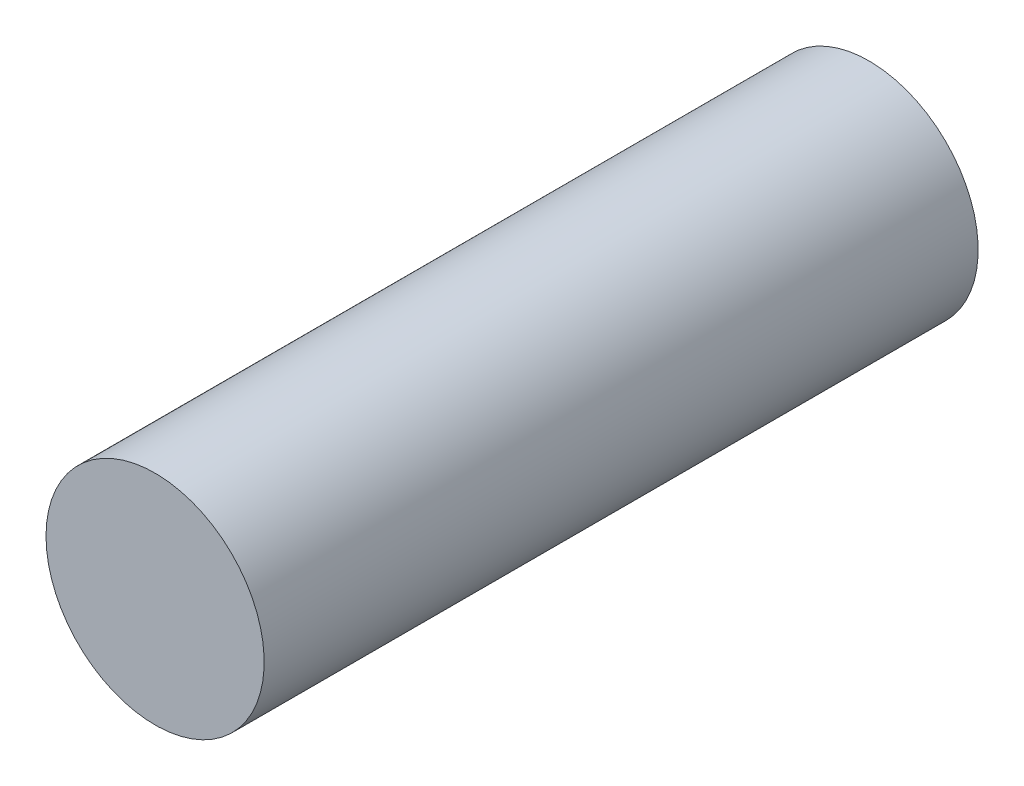
ISO-10303-21;
HEADER;
FILE_DESCRIPTION(('STEP AP214'),'2;1');
FILE_NAME('part.step','',(''),(''),'','','');
FILE_SCHEMA(('AUTOMOTIVE_DESIGN { 1 0 10303 214 1 1 1 1 }'));
ENDSEC;
DATA;
#1=APPLICATION_CONTEXT('core data for automotive mechanical design processes');
#2=APPLICATION_PROTOCOL_DEFINITION('international standard','automotive_design',2000,#1);
#3=PRODUCT_CONTEXT('',#1,'mechanical');
#4=PRODUCT('Part','Part','',(#3));
#5=PRODUCT_RELATED_PRODUCT_CATEGORY('part','',(#4));
#6=PRODUCT_DEFINITION_FORMATION('','',#4);
#7=PRODUCT_DEFINITION_CONTEXT('part definition',#1,'design');
#8=PRODUCT_DEFINITION('design','',#6,#7);
#9=PRODUCT_DEFINITION_SHAPE('','',#8);
#10=(LENGTH_UNIT() NAMED_UNIT(*) SI_UNIT(.MILLI.,.METRE.));
#11=(NAMED_UNIT(*) PLANE_ANGLE_UNIT() SI_UNIT($,.RADIAN.));
#12=(NAMED_UNIT(*) SI_UNIT($,.STERADIAN.) SOLID_ANGLE_UNIT());
#13=UNCERTAINTY_MEASURE_WITH_UNIT(LENGTH_MEASURE(1.E-05),#10,'distance_accuracy_value','');
#14=(GEOMETRIC_REPRESENTATION_CONTEXT(3) GLOBAL_UNCERTAINTY_ASSIGNED_CONTEXT((#13)) GLOBAL_UNIT_ASSIGNED_CONTEXT((#10,
#11,#12)) REPRESENTATION_CONTEXT('',''));
#15=CARTESIAN_POINT('',(0.,0.,0.));
#16=DIRECTION('',(0.,0.,1.));
#17=DIRECTION('',(1.,0.,0.));
#18=AXIS2_PLACEMENT_3D('',#15,#16,#17);
#19=CARTESIAN_POINT('',(0.,0.,24.13));
#20=DIRECTION('',(0.,0.,-1.));
#21=DIRECTION('',(-1.,0.,0.));
#22=AXIS2_PLACEMENT_3D('',#19,#20,#21);
#23=CONICAL_SURFACE('',#22,3.6,1.33525134607402);
#24=CARTESIAN_POINT('',(0.,0.,24.43));
#25=DIRECTION('',(0.,0.,-1.));
#26=DIRECTION('',(-1.,0.,0.));
#27=AXIS2_PLACEMENT_3D('',#24,#25,#26);
#28=CIRCLE('',#27,2.35);
#29=CARTESIAN_POINT('',(-2.35,0.,24.43));
#30=VERTEX_POINT('',#29);
#31=EDGE_CURVE('E11',#30,#30,#28,.T.);
#32=ORIENTED_EDGE('',*,*,#31,.F.);
#33=EDGE_LOOP('',(#32));
#34=FACE_BOUND('',#33,.T.);
#35=CARTESIAN_POINT('',(0.,0.,24.13));
#36=DIRECTION('',(0.,0.,-1.));
#37=DIRECTION('',(-1.,0.,0.));
#38=AXIS2_PLACEMENT_3D('',#35,#36,#37);
#39=CIRCLE('',#38,3.6);
#40=CARTESIAN_POINT('',(-3.6,0.,24.13));
#41=VERTEX_POINT('',#40);
#42=EDGE_CURVE('E64',#41,#41,#39,.T.);
#43=ORIENTED_EDGE('',*,*,#42,.T.);
#44=EDGE_LOOP('',(#43));
#45=FACE_BOUND('',#44,.T.);
#46=ADVANCED_FACE('F45',(#34,#45),#23,.F.);
#47=CARTESIAN_POINT('',(0.,0.,24.43));
#48=DIRECTION('',(0.,0.,1.));
#49=DIRECTION('',(1.,0.,0.));
#50=AXIS2_PLACEMENT_3D('',#47,#48,#49);
#51=CONICAL_SURFACE('',#50,2.35,0.343023940420703);
#52=CARTESIAN_POINT('',(0.,0.,27.93));
#53=DIRECTION('',(0.,0.,-1.));
#54=DIRECTION('',(-1.,0.,0.));
#55=AXIS2_PLACEMENT_3D('',#52,#53,#54);
#56=CIRCLE('',#55,3.6);
#57=CARTESIAN_POINT('',(-3.6,0.,27.93));
#58=VERTEX_POINT('',#57);
#59=EDGE_CURVE('E51',#58,#58,#56,.T.);
#60=ORIENTED_EDGE('',*,*,#59,.F.);
#61=EDGE_LOOP('',(#60));
#62=FACE_BOUND('',#61,.T.);
#63=ORIENTED_EDGE('',*,*,#31,.T.);
#64=EDGE_LOOP('',(#63));
#65=FACE_BOUND('',#64,.T.);
#66=ADVANCED_FACE('F83',(#62,#65),#51,.F.);
#67=CARTESIAN_POINT('',(4.4,0.,27.93));
#68=DIRECTION('',(0.,0.,-1.));
#69=DIRECTION('',(-1.,0.,0.));
#70=AXIS2_PLACEMENT_3D('',#67,#68,#69);
#71=PLANE('',#70);
#72=CARTESIAN_POINT('',(0.,0.,27.93));
#73=DIRECTION('',(0.,0.,-1.));
#74=DIRECTION('',(-1.,0.,0.));
#75=AXIS2_PLACEMENT_3D('',#72,#73,#74);
#76=CIRCLE('',#75,4.4);
#77=CARTESIAN_POINT('',(-4.4,0.,27.93));
#78=VERTEX_POINT('',#77);
#79=EDGE_CURVE('E55',#78,#78,#76,.T.);
#80=ORIENTED_EDGE('',*,*,#79,.F.);
#81=EDGE_LOOP('',(#80));
#82=FACE_BOUND('',#81,.T.);
#83=ORIENTED_EDGE('',*,*,#59,.T.);
#84=EDGE_LOOP('',(#83));
#85=FACE_BOUND('',#84,.T.);
#86=ADVANCED_FACE('F78',(#82,#85),#71,.F.);
#87=CARTESIAN_POINT('',(0.,0.,-200.));
#88=DIRECTION('',(0.,0.,-1.));
#89=DIRECTION('',(-1.,0.,0.));
#90=AXIS2_PLACEMENT_3D('',#87,#88,#89);
#91=CYLINDRICAL_SURFACE('',#90,4.4);
#92=CARTESIAN_POINT('',(0.,0.,24.13));
#93=DIRECTION('',(0.,0.,-1.));
#94=DIRECTION('',(-1.,0.,0.));
#95=AXIS2_PLACEMENT_3D('',#92,#93,#94);
#96=CIRCLE('',#95,4.4);
#97=CARTESIAN_POINT('',(-4.4,0.,24.13));
#98=VERTEX_POINT('',#97);
#99=EDGE_CURVE('E59',#98,#98,#96,.T.);
#100=ORIENTED_EDGE('',*,*,#99,.F.);
#101=EDGE_LOOP('',(#100));
#102=FACE_BOUND('',#101,.T.);
#103=ORIENTED_EDGE('',*,*,#79,.T.);
#104=EDGE_LOOP('',(#103));
#105=FACE_BOUND('',#104,.T.);
#106=ADVANCED_FACE('F72',(#102,#105),#91,.T.);
#107=CARTESIAN_POINT('',(3.6,0.,24.13));
#108=DIRECTION('',(0.,0.,1.));
#109=DIRECTION('',(1.,0.,0.));
#110=AXIS2_PLACEMENT_3D('',#107,#108,#109);
#111=PLANE('',#110);
#112=ORIENTED_EDGE('',*,*,#42,.F.);
#113=EDGE_LOOP('',(#112));
#114=FACE_BOUND('',#113,.T.);
#115=ORIENTED_EDGE('',*,*,#99,.T.);
#116=EDGE_LOOP('',(#115));
#117=FACE_BOUND('',#116,.T.);
#118=ADVANCED_FACE('F69',(#114,#117),#111,.F.);
#119=CLOSED_SHELL('',(#46,#66,#86,#106,#118));
#120=MANIFOLD_SOLID_BREP('B2',#119);
#121=CARTESIAN_POINT('',(0.,0.,0.));
#122=DIRECTION('',(0.,0.,-1.));
#123=DIRECTION('',(-1.,0.,0.));
#124=AXIS2_PLACEMENT_3D('',#121,#122,#123);
#125=CONICAL_SURFACE('',#124,3.8,0.785398163397434);
#126=CARTESIAN_POINT('',(0.,0.,0.400000000000011));
#127=DIRECTION('',(0.,0.,-1.));
#128=DIRECTION('',(-1.,0.,0.));
#129=AXIS2_PLACEMENT_3D('',#126,#127,#128);
#130=CIRCLE('',#129,3.4);
#131=CARTESIAN_POINT('',(-3.4,0.,0.400000000000011));
#132=VERTEX_POINT('',#131);
#133=EDGE_CURVE('E141',#132,#132,#130,.T.);
#134=ORIENTED_EDGE('',*,*,#133,.F.);
#135=EDGE_LOOP('',(#134));
#136=FACE_BOUND('',#135,.T.);
#137=CARTESIAN_POINT('',(0.,0.,0.));
#138=DIRECTION('',(0.,0.,-1.));
#139=DIRECTION('',(-1.,0.,0.));
#140=AXIS2_PLACEMENT_3D('',#137,#138,#139);
#141=CIRCLE('',#140,3.8);
#142=CARTESIAN_POINT('',(-3.8,0.,0.));
#143=VERTEX_POINT('',#142);
#144=EDGE_CURVE('E44',#143,#143,#141,.T.);
#145=ORIENTED_EDGE('',*,*,#144,.T.);
#146=EDGE_LOOP('',(#145));
#147=FACE_BOUND('',#146,.T.);
#148=ADVANCED_FACE('F122',(#136,#147),#125,.F.);
#149=CARTESIAN_POINT('',(3.8,0.,0.));
#150=DIRECTION('',(0.,0.,1.));
#151=DIRECTION('',(1.,0.,0.));
#152=AXIS2_PLACEMENT_3D('',#149,#150,#151);
#153=PLANE('',#152);
#154=ORIENTED_EDGE('',*,*,#144,.F.);
#155=EDGE_LOOP('',(#154));
#156=FACE_BOUND('',#155,.T.);
#157=CARTESIAN_POINT('',(0.,0.,0.));
#158=DIRECTION('',(0.,0.,-1.));
#159=DIRECTION('',(-1.,0.,0.));
#160=AXIS2_PLACEMENT_3D('',#157,#158,#159);
#161=CIRCLE('',#160,5.5);
#162=CARTESIAN_POINT('',(-5.5,0.,0.));
#163=VERTEX_POINT('',#162);
#164=EDGE_CURVE('E128',#163,#163,#161,.T.);
#165=ORIENTED_EDGE('',*,*,#164,.T.);
#166=EDGE_LOOP('',(#165));
#167=FACE_BOUND('',#166,.T.);
#168=ADVANCED_FACE('F148',(#156,#167),#153,.F.);
#169=CARTESIAN_POINT('',(0.,0.,-200.));
#170=DIRECTION('',(0.,0.,-1.));
#171=DIRECTION('',(-1.,0.,0.));
#172=AXIS2_PLACEMENT_3D('',#169,#170,#171);
#173=CYLINDRICAL_SURFACE('',#172,5.5);
#174=ORIENTED_EDGE('',*,*,#164,.F.);
#175=EDGE_LOOP('',(#174));
#176=FACE_BOUND('',#175,.T.);
#177=CARTESIAN_POINT('',(0.,0.,36.));
#178=DIRECTION('',(0.,0.,-1.));
#179=DIRECTION('',(-1.,0.,0.));
#180=AXIS2_PLACEMENT_3D('',#177,#178,#179);
#181=CIRCLE('',#180,5.5);
#182=CARTESIAN_POINT('',(-5.5,0.,36.));
#183=VERTEX_POINT('',#182);
#184=EDGE_CURVE('E132',#183,#183,#181,.T.);
#185=ORIENTED_EDGE('',*,*,#184,.T.);
#186=EDGE_LOOP('',(#185));
#187=FACE_BOUND('',#186,.T.);
#188=ADVANCED_FACE('F152',(#176,#187),#173,.T.);
#189=CARTESIAN_POINT('',(5.5,0.,36.));
#190=DIRECTION('',(0.,0.,-1.));
#191=DIRECTION('',(-1.,0.,0.));
#192=AXIS2_PLACEMENT_3D('',#189,#190,#191);
#193=PLANE('',#192);
#194=ORIENTED_EDGE('',*,*,#184,.F.);
#195=EDGE_LOOP('',(#194));
#196=FACE_BOUND('',#195,.T.);
#197=ADVANCED_FACE('F157',(#196),#193,.F.);
#198=CARTESIAN_POINT('',(0.,0.,33.));
#199=DIRECTION('',(0.,0.,1.));
#200=DIRECTION('',(1.,0.,0.));
#201=AXIS2_PLACEMENT_3D('',#198,#199,#200);
#202=PLANE('',#201);
#203=CARTESIAN_POINT('',(0.,0.,33.));
#204=DIRECTION('',(0.,0.,-1.));
#205=DIRECTION('',(-1.,0.,0.));
#206=AXIS2_PLACEMENT_3D('',#203,#204,#205);
#207=CIRCLE('',#206,3.4);
#208=CARTESIAN_POINT('',(-3.4,0.,33.));
#209=VERTEX_POINT('',#208);
#210=EDGE_CURVE('E136',#209,#209,#207,.T.);
#211=ORIENTED_EDGE('',*,*,#210,.T.);
#212=EDGE_LOOP('',(#211));
#213=FACE_BOUND('',#212,.T.);
#214=ADVANCED_FACE('F163',(#213),#202,.F.);
#215=CARTESIAN_POINT('',(0.,0.,-200.));
#216=DIRECTION('',(0.,0.,-1.));
#217=DIRECTION('',(-1.,0.,0.));
#218=AXIS2_PLACEMENT_3D('',#215,#216,#217);
#219=CYLINDRICAL_SURFACE('',#218,3.4);
#220=ORIENTED_EDGE('',*,*,#210,.F.);
#221=EDGE_LOOP('',(#220));
#222=FACE_BOUND('',#221,.T.);
#223=ORIENTED_EDGE('',*,*,#133,.T.);
#224=EDGE_LOOP('',(#223));
#225=FACE_BOUND('',#224,.T.);
#226=ADVANCED_FACE('F145',(#222,#225),#219,.F.);
#227=CLOSED_SHELL('',(#148,#168,#188,#197,#214,#226));
#228=MANIFOLD_SOLID_BREP('B6',#227);
#229=ADVANCED_BREP_SHAPE_REPRESENTATION('',(#18,#120,#228),#14);
#230=SHAPE_DEFINITION_REPRESENTATION(#9,#229);
ENDSEC;
END-ISO-10303-21;
